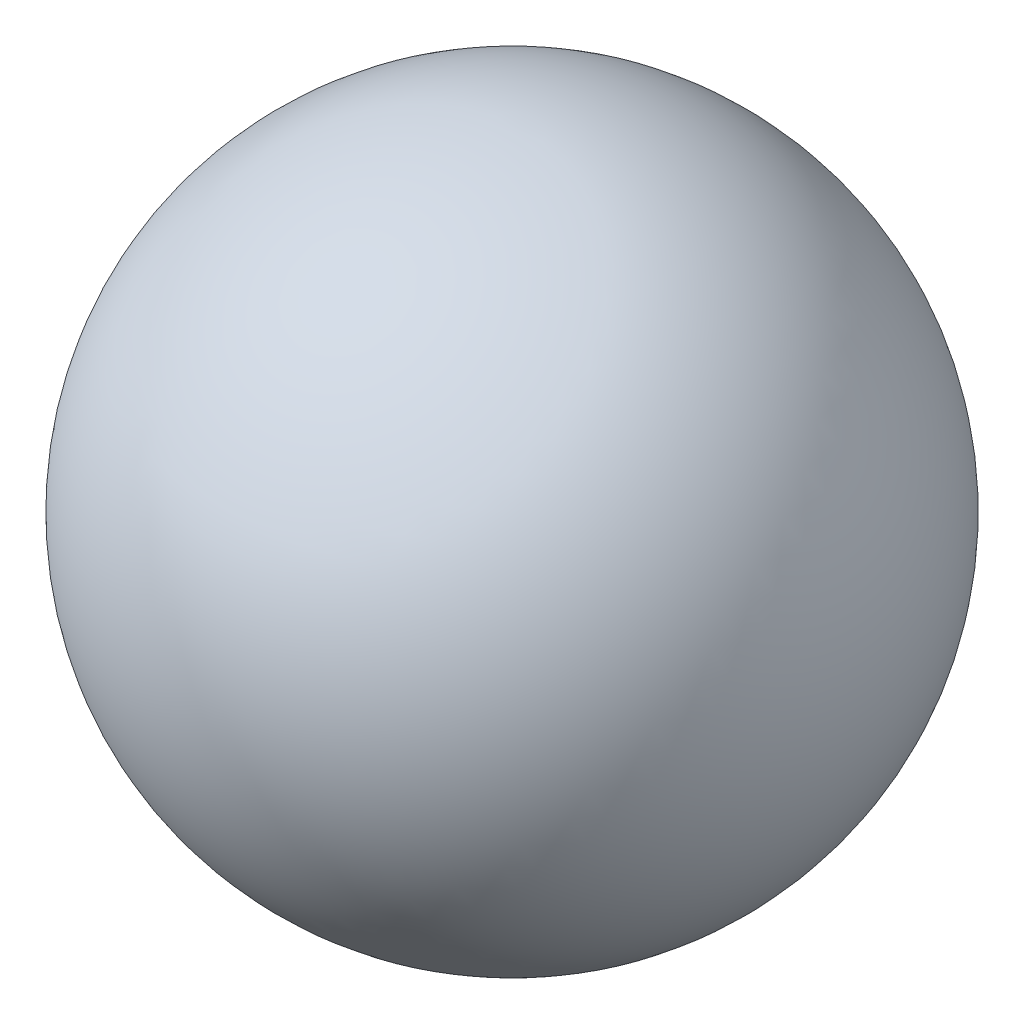
ISO-10303-21;
HEADER;
FILE_DESCRIPTION(('STEP AP214'),'2;1');
FILE_NAME('part.step','',(''),(''),'','','');
FILE_SCHEMA(('AUTOMOTIVE_DESIGN { 1 0 10303 214 1 1 1 1 }'));
ENDSEC;
DATA;
#1=APPLICATION_CONTEXT('core data for automotive mechanical design processes');
#2=APPLICATION_PROTOCOL_DEFINITION('international standard','automotive_design',2000,#1);
#3=PRODUCT_CONTEXT('',#1,'mechanical');
#4=PRODUCT('Part','Part','',(#3));
#5=PRODUCT_RELATED_PRODUCT_CATEGORY('part','',(#4));
#6=PRODUCT_DEFINITION_FORMATION('','',#4);
#7=PRODUCT_DEFINITION_CONTEXT('part definition',#1,'design');
#8=PRODUCT_DEFINITION('design','',#6,#7);
#9=PRODUCT_DEFINITION_SHAPE('','',#8);
#10=(LENGTH_UNIT() NAMED_UNIT(*) SI_UNIT(.MILLI.,.METRE.));
#11=(NAMED_UNIT(*) PLANE_ANGLE_UNIT() SI_UNIT($,.RADIAN.));
#12=(NAMED_UNIT(*) SI_UNIT($,.STERADIAN.) SOLID_ANGLE_UNIT());
#13=UNCERTAINTY_MEASURE_WITH_UNIT(LENGTH_MEASURE(1.E-05),#10,'distance_accuracy_value','');
#14=(GEOMETRIC_REPRESENTATION_CONTEXT(3) GLOBAL_UNCERTAINTY_ASSIGNED_CONTEXT((#13)) GLOBAL_UNIT_ASSIGNED_CONTEXT((#10,
#11,#12)) REPRESENTATION_CONTEXT('',''));
#15=CARTESIAN_POINT('',(0.,0.,0.));
#16=DIRECTION('',(0.,0.,1.));
#17=DIRECTION('',(1.,0.,0.));
#18=AXIS2_PLACEMENT_3D('',#15,#16,#17);
#19=CARTESIAN_POINT('',(0.,0.,0.));
#20=DIRECTION('',(0.,1.,0.));
#21=DIRECTION('',(1.,0.,0.));
#22=AXIS2_PLACEMENT_3D('',#19,#20,#21);
#23=SPHERICAL_SURFACE('',#22,24.5);
#24=CARTESIAN_POINT('',(0.,24.5,0.));
#25=VERTEX_POINT('',#24);
#26=VERTEX_LOOP('',#25);
#27=FACE_BOUND('',#26,.T.);
#28=ADVANCED_FACE('F31',(#27),#23,.T.);
#29=CLOSED_SHELL('',(#28));
#30=MANIFOLD_SOLID_BREP('B2',#29);
#31=ADVANCED_BREP_SHAPE_REPRESENTATION('',(#18,#30),#14);
#32=SHAPE_DEFINITION_REPRESENTATION(#9,#31);
ENDSEC;
END-ISO-10303-21;
